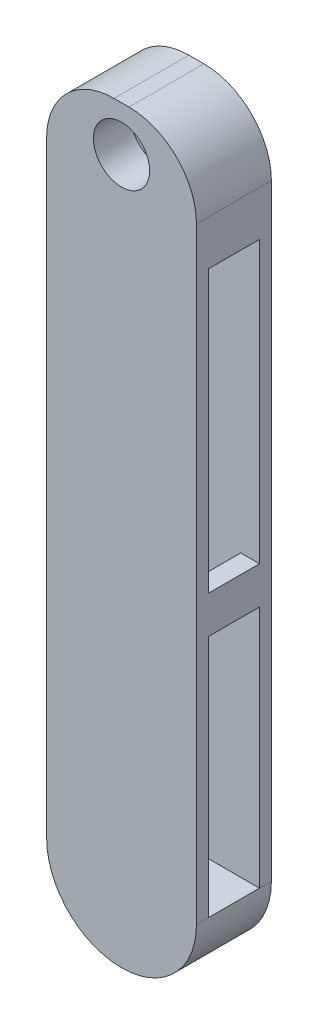
ISO-10303-21;
HEADER;
FILE_DESCRIPTION(('STEP AP214'),'2;1');
FILE_NAME('part.step','',(''),(''),'','','');
FILE_SCHEMA(('AUTOMOTIVE_DESIGN { 1 0 10303 214 1 1 1 1 }'));
ENDSEC;
DATA;
#1=APPLICATION_CONTEXT('core data for automotive mechanical design processes');
#2=APPLICATION_PROTOCOL_DEFINITION('international standard','automotive_design',2000,#1);
#3=PRODUCT_CONTEXT('',#1,'mechanical');
#4=PRODUCT('Part','Part','',(#3));
#5=PRODUCT_RELATED_PRODUCT_CATEGORY('part','',(#4));
#6=PRODUCT_DEFINITION_FORMATION('','',#4);
#7=PRODUCT_DEFINITION_CONTEXT('part definition',#1,'design');
#8=PRODUCT_DEFINITION('design','',#6,#7);
#9=PRODUCT_DEFINITION_SHAPE('','',#8);
#10=(LENGTH_UNIT() NAMED_UNIT(*) SI_UNIT(.MILLI.,.METRE.));
#11=(NAMED_UNIT(*) PLANE_ANGLE_UNIT() SI_UNIT($,.RADIAN.));
#12=(NAMED_UNIT(*) SI_UNIT($,.STERADIAN.) SOLID_ANGLE_UNIT());
#13=UNCERTAINTY_MEASURE_WITH_UNIT(LENGTH_MEASURE(1.E-05),#10,'distance_accuracy_value','');
#14=(GEOMETRIC_REPRESENTATION_CONTEXT(3) GLOBAL_UNCERTAINTY_ASSIGNED_CONTEXT((#13)) GLOBAL_UNIT_ASSIGNED_CONTEXT((#10,
#11,#12)) REPRESENTATION_CONTEXT('',''));
#15=CARTESIAN_POINT('',(0.,0.,0.));
#16=DIRECTION('',(0.,0.,1.));
#17=DIRECTION('',(1.,0.,0.));
#18=AXIS2_PLACEMENT_3D('',#15,#16,#17);
#19=CARTESIAN_POINT('',(20.,-80.,3.175));
#20=DIRECTION('',(0.,0.,-1.));
#21=DIRECTION('',(-1.,0.,0.));
#22=AXIS2_PLACEMENT_3D('',#19,#20,#21);
#23=PLANE('',#22);
#24=DIRECTION('',(0.,1.,0.));
#25=VECTOR('',#24,1.);
#26=CARTESIAN_POINT('',(15.,-80.,3.175));
#27=LINE('',#26,#25);
#28=CARTESIAN_POINT('',(15.,-15.,3.175));
#29=VERTEX_POINT('',#28);
#30=CARTESIAN_POINT('',(15.,-5.00000000000001,3.175));
#31=VERTEX_POINT('',#30);
#32=EDGE_CURVE('E209',#29,#31,#27,.T.);
#33=ORIENTED_EDGE('',*,*,#32,.T.);
#34=DIRECTION('',(1.,0.,0.));
#35=VECTOR('',#34,1.);
#36=CARTESIAN_POINT('',(20.,-5.,3.175));
#37=LINE('',#36,#35);
#38=CARTESIAN_POINT('',(20.,-5.,3.175));
#39=VERTEX_POINT('',#38);
#40=EDGE_CURVE('E173',#31,#39,#37,.T.);
#41=ORIENTED_EDGE('',*,*,#40,.T.);
#42=DIRECTION('',(0.,-1.,0.));
#43=VECTOR('',#42,1.);
#44=CARTESIAN_POINT('',(20.,-80.,3.175));
#45=LINE('',#44,#43);
#46=CARTESIAN_POINT('',(20.,70.,3.175));
#47=VERTEX_POINT('',#46);
#48=EDGE_CURVE('E253',#47,#39,#45,.T.);
#49=ORIENTED_EDGE('',*,*,#48,.F.);
#50=DIRECTION('',(-1.,0.,0.));
#51=VECTOR('',#50,1.);
#52=CARTESIAN_POINT('',(20.,70.,3.175));
#53=LINE('',#52,#51);
#54=CARTESIAN_POINT('',(-20.,70.,3.175));
#55=VERTEX_POINT('',#54);
#56=EDGE_CURVE('E286',#47,#55,#53,.T.);
#57=ORIENTED_EDGE('',*,*,#56,.T.);
#58=DIRECTION('',(0.,-1.,0.));
#59=VECTOR('',#58,1.);
#60=CARTESIAN_POINT('',(-20.,-80.,3.175));
#61=LINE('',#60,#59);
#62=CARTESIAN_POINT('',(-20.,-5.,3.175));
#63=VERTEX_POINT('',#62);
#64=EDGE_CURVE('E271',#55,#63,#61,.T.);
#65=ORIENTED_EDGE('',*,*,#64,.T.);
#66=DIRECTION('',(-1.,0.,0.));
#67=VECTOR('',#66,1.);
#68=CARTESIAN_POINT('',(20.,-5.,3.175));
#69=LINE('',#68,#67);
#70=CARTESIAN_POINT('',(-15.,-5.,3.175));
#71=VERTEX_POINT('',#70);
#72=EDGE_CURVE('E240',#71,#63,#69,.T.);
#73=ORIENTED_EDGE('',*,*,#72,.F.);
#74=DIRECTION('',(0.,1.,0.));
#75=VECTOR('',#74,1.);
#76=CARTESIAN_POINT('',(-15.,-80.,3.175));
#77=LINE('',#76,#75);
#78=CARTESIAN_POINT('',(-15.,-15.,3.175));
#79=VERTEX_POINT('',#78);
#80=EDGE_CURVE('E248',#79,#71,#77,.T.);
#81=ORIENTED_EDGE('',*,*,#80,.F.);
#82=DIRECTION('',(1.,0.,0.));
#83=VECTOR('',#82,1.);
#84=CARTESIAN_POINT('',(20.,-15.,3.175));
#85=LINE('',#84,#83);
#86=CARTESIAN_POINT('',(-20.,-15.,3.175));
#87=VERTEX_POINT('',#86);
#88=EDGE_CURVE('E244',#87,#79,#85,.T.);
#89=ORIENTED_EDGE('',*,*,#88,.F.);
#90=CARTESIAN_POINT('',(-20.,-80.,3.175));
#91=VERTEX_POINT('',#90);
#92=EDGE_CURVE('E252',#87,#91,#61,.T.);
#93=ORIENTED_EDGE('',*,*,#92,.T.);
#94=DIRECTION('',(-1.,0.,0.));
#95=VECTOR('',#94,1.);
#96=CARTESIAN_POINT('',(20.,-80.,3.175));
#97=LINE('',#96,#95);
#98=CARTESIAN_POINT('',(20.,-80.,3.175));
#99=VERTEX_POINT('',#98);
#100=EDGE_CURVE('E270',#99,#91,#97,.T.);
#101=ORIENTED_EDGE('',*,*,#100,.F.);
#102=CARTESIAN_POINT('',(20.,-15.,3.175));
#103=VERTEX_POINT('',#102);
#104=EDGE_CURVE('E258',#103,#99,#45,.T.);
#105=ORIENTED_EDGE('',*,*,#104,.F.);
#106=DIRECTION('',(-1.,0.,0.));
#107=VECTOR('',#106,1.);
#108=CARTESIAN_POINT('',(20.,-15.,3.175));
#109=LINE('',#108,#107);
#110=EDGE_CURVE('E177',#103,#29,#109,.T.);
#111=ORIENTED_EDGE('',*,*,#110,.T.);
#112=EDGE_LOOP('',(#33,#41,#49,#57,#65,#73,#81,#89,#93,#101,#105,#111));
#113=FACE_BOUND('',#112,.T.);
#114=ADVANCED_FACE('F39',(#113),#23,.F.);
#115=CARTESIAN_POINT('',(20.,-80.,16.825));
#116=DIRECTION('',(0.,0.,1.));
#117=DIRECTION('',(1.,0.,0.));
#118=AXIS2_PLACEMENT_3D('',#115,#116,#117);
#119=PLANE('',#118);
#120=DIRECTION('',(0.,1.,0.));
#121=VECTOR('',#120,1.);
#122=CARTESIAN_POINT('',(20.,-80.,16.825));
#123=LINE('',#122,#121);
#124=CARTESIAN_POINT('',(20.,-5.,16.825));
#125=VERTEX_POINT('',#124);
#126=CARTESIAN_POINT('',(20.,70.,16.825));
#127=VERTEX_POINT('',#126);
#128=EDGE_CURVE('E190',#125,#127,#123,.T.);
#129=ORIENTED_EDGE('',*,*,#128,.F.);
#130=DIRECTION('',(-1.,0.,0.));
#131=VECTOR('',#130,1.);
#132=CARTESIAN_POINT('',(20.,-5.,16.825));
#133=LINE('',#132,#131);
#134=CARTESIAN_POINT('',(15.,-5.00000000000001,16.825));
#135=VERTEX_POINT('',#134);
#136=EDGE_CURVE('E63',#125,#135,#133,.T.);
#137=ORIENTED_EDGE('',*,*,#136,.T.);
#138=DIRECTION('',(0.,-1.,0.));
#139=VECTOR('',#138,1.);
#140=CARTESIAN_POINT('',(15.,-5.00000000000001,16.825));
#141=LINE('',#140,#139);
#142=CARTESIAN_POINT('',(15.,-15.,16.825));
#143=VERTEX_POINT('',#142);
#144=EDGE_CURVE('E181',#135,#143,#141,.T.);
#145=ORIENTED_EDGE('',*,*,#144,.T.);
#146=DIRECTION('',(1.,0.,0.));
#147=VECTOR('',#146,1.);
#148=CARTESIAN_POINT('',(20.,-15.,16.825));
#149=LINE('',#148,#147);
#150=CARTESIAN_POINT('',(20.,-15.,16.825));
#151=VERTEX_POINT('',#150);
#152=EDGE_CURVE('E192',#143,#151,#149,.T.);
#153=ORIENTED_EDGE('',*,*,#152,.T.);
#154=CARTESIAN_POINT('',(20.,-80.,16.825));
#155=VERTEX_POINT('',#154);
#156=EDGE_CURVE('E262',#155,#151,#123,.T.);
#157=ORIENTED_EDGE('',*,*,#156,.F.);
#158=DIRECTION('',(-1.,0.,0.));
#159=VECTOR('',#158,1.);
#160=CARTESIAN_POINT('',(20.,-80.,16.825));
#161=LINE('',#160,#159);
#162=CARTESIAN_POINT('',(-20.,-80.,16.825));
#163=VERTEX_POINT('',#162);
#164=EDGE_CURVE('E294',#155,#163,#161,.T.);
#165=ORIENTED_EDGE('',*,*,#164,.T.);
#166=DIRECTION('',(0.,1.,0.));
#167=VECTOR('',#166,1.);
#168=CARTESIAN_POINT('',(-20.,-80.,16.825));
#169=LINE('',#168,#167);
#170=CARTESIAN_POINT('',(-20.,-15.,16.825));
#171=VERTEX_POINT('',#170);
#172=EDGE_CURVE('E279',#163,#171,#169,.T.);
#173=ORIENTED_EDGE('',*,*,#172,.T.);
#174=DIRECTION('',(-1.,0.,0.));
#175=VECTOR('',#174,1.);
#176=CARTESIAN_POINT('',(-20.,-15.,16.825));
#177=LINE('',#176,#175);
#178=CARTESIAN_POINT('',(-15.,-15.,16.825));
#179=VERTEX_POINT('',#178);
#180=EDGE_CURVE('E216',#179,#171,#177,.T.);
#181=ORIENTED_EDGE('',*,*,#180,.F.);
#182=DIRECTION('',(0.,-1.,0.));
#183=VECTOR('',#182,1.);
#184=CARTESIAN_POINT('',(-15.,-5.00000000000001,16.825));
#185=LINE('',#184,#183);
#186=CARTESIAN_POINT('',(-15.,-5.00000000000001,16.825));
#187=VERTEX_POINT('',#186);
#188=EDGE_CURVE('E212',#187,#179,#185,.T.);
#189=ORIENTED_EDGE('',*,*,#188,.F.);
#190=DIRECTION('',(1.,0.,0.));
#191=VECTOR('',#190,1.);
#192=CARTESIAN_POINT('',(-20.,-5.,16.825));
#193=LINE('',#192,#191);
#194=CARTESIAN_POINT('',(-20.,-4.99999999999999,16.825));
#195=VERTEX_POINT('',#194);
#196=EDGE_CURVE('E220',#195,#187,#193,.T.);
#197=ORIENTED_EDGE('',*,*,#196,.F.);
#198=CARTESIAN_POINT('',(-20.,70.,16.825));
#199=VERTEX_POINT('',#198);
#200=EDGE_CURVE('E278',#195,#199,#169,.T.);
#201=ORIENTED_EDGE('',*,*,#200,.T.);
#202=DIRECTION('',(-1.,0.,0.));
#203=VECTOR('',#202,1.);
#204=CARTESIAN_POINT('',(20.,70.,16.825));
#205=LINE('',#204,#203);
#206=EDGE_CURVE('E290',#127,#199,#205,.T.);
#207=ORIENTED_EDGE('',*,*,#206,.F.);
#208=EDGE_LOOP('',(#129,#137,#145,#153,#157,#165,#173,#181,#189,#197,#201,#207));
#209=FACE_BOUND('',#208,.T.);
#210=ADVANCED_FACE('F188',(#209),#119,.F.);
#211=CARTESIAN_POINT('',(20.,-100.,20.));
#212=DIRECTION('',(-1.,0.,0.));
#213=DIRECTION('',(0.,0.,1.));
#214=AXIS2_PLACEMENT_3D('',#211,#212,#213);
#215=PLANE('',#214);
#216=DIRECTION('',(0.,0.,1.));
#217=VECTOR('',#216,1.);
#218=CARTESIAN_POINT('',(20.,-15.,1.825));
#219=LINE('',#218,#217);
#220=EDGE_CURVE('E199',#103,#151,#219,.T.);
#221=ORIENTED_EDGE('',*,*,#220,.F.);
#222=ORIENTED_EDGE('',*,*,#104,.T.);
#223=DIRECTION('',(0.,0.,-1.));
#224=VECTOR('',#223,1.);
#225=CARTESIAN_POINT('',(20.,-80.,20.));
#226=LINE('',#225,#224);
#227=CARTESIAN_POINT('',(20.,-80.,0.));
#228=VERTEX_POINT('',#227);
#229=EDGE_CURVE('E330',#99,#228,#226,.T.);
#230=ORIENTED_EDGE('',*,*,#229,.T.);
#231=DIRECTION('',(0.,1.,0.));
#232=VECTOR('',#231,1.);
#233=CARTESIAN_POINT('',(20.,-100.,0.));
#234=LINE('',#233,#232);
#235=CARTESIAN_POINT('',(20.,82.,0.));
#236=VERTEX_POINT('',#235);
#237=EDGE_CURVE('E312',#228,#236,#234,.T.);
#238=ORIENTED_EDGE('',*,*,#237,.T.);
#239=DIRECTION('',(0.,0.,-1.));
#240=VECTOR('',#239,1.);
#241=CARTESIAN_POINT('',(20.,82.,20.));
#242=LINE('',#241,#240);
#243=CARTESIAN_POINT('',(20.,82.,20.));
#244=VERTEX_POINT('',#243);
#245=EDGE_CURVE('E378',#236,#244,#242,.F.);
#246=ORIENTED_EDGE('',*,*,#245,.T.);
#247=DIRECTION('',(0.,1.,0.));
#248=VECTOR('',#247,1.);
#249=CARTESIAN_POINT('',(20.,-100.,20.));
#250=LINE('',#249,#248);
#251=CARTESIAN_POINT('',(20.,-80.,20.));
#252=VERTEX_POINT('',#251);
#253=EDGE_CURVE('E317',#252,#244,#250,.T.);
#254=ORIENTED_EDGE('',*,*,#253,.F.);
#255=EDGE_CURVE('E340',#252,#155,#226,.T.);
#256=ORIENTED_EDGE('',*,*,#255,.T.);
#257=ORIENTED_EDGE('',*,*,#156,.T.);
#258=EDGE_LOOP('',(#221,#222,#230,#238,#246,#254,#256,#257));
#259=FACE_BOUND('',#258,.T.);
#260=ORIENTED_EDGE('',*,*,#48,.T.);
#261=DIRECTION('',(0.,0.,1.));
#262=VECTOR('',#261,1.);
#263=CARTESIAN_POINT('',(20.,-5.,1.825));
#264=LINE('',#263,#262);
#265=EDGE_CURVE('E178',#39,#125,#264,.T.);
#266=ORIENTED_EDGE('',*,*,#265,.T.);
#267=ORIENTED_EDGE('',*,*,#128,.T.);
#268=DIRECTION('',(0.,0.,-1.));
#269=VECTOR('',#268,1.);
#270=CARTESIAN_POINT('',(20.,70.,3.175));
#271=LINE('',#270,#269);
#272=EDGE_CURVE('E266',#127,#47,#271,.T.);
#273=ORIENTED_EDGE('',*,*,#272,.T.);
#274=EDGE_LOOP('',(#260,#266,#267,#273));
#275=FACE_BOUND('',#274,.T.);
#276=ADVANCED_FACE('F403',(#259,#275),#215,.F.);
#277=CARTESIAN_POINT('',(-20.,100.,20.));
#278=DIRECTION('',(0.,-1.,0.));
#279=DIRECTION('',(0.,0.,-1.));
#280=AXIS2_PLACEMENT_3D('',#277,#278,#279);
#281=PLANE('',#280);
#282=DIRECTION('',(-1.,0.,0.));
#283=VECTOR('',#282,1.);
#284=CARTESIAN_POINT('',(-20.,100.,20.));
#285=LINE('',#284,#283);
#286=CARTESIAN_POINT('',(2.00000000000001,100.,20.));
#287=VERTEX_POINT('',#286);
#288=CARTESIAN_POINT('',(-2.,100.,20.));
#289=VERTEX_POINT('',#288);
#290=EDGE_CURVE('E321',#287,#289,#285,.T.);
#291=ORIENTED_EDGE('',*,*,#290,.F.);
#292=DIRECTION('',(0.,0.,-1.));
#293=VECTOR('',#292,1.);
#294=CARTESIAN_POINT('',(2.00000000000001,100.,20.));
#295=LINE('',#294,#293);
#296=CARTESIAN_POINT('',(2.00000000000001,100.,0.));
#297=VERTEX_POINT('',#296);
#298=EDGE_CURVE('E368',#287,#297,#295,.T.);
#299=ORIENTED_EDGE('',*,*,#298,.T.);
#300=DIRECTION('',(-1.,0.,0.));
#301=VECTOR('',#300,1.);
#302=CARTESIAN_POINT('',(-20.,100.,0.));
#303=LINE('',#302,#301);
#304=CARTESIAN_POINT('',(-2.,100.,0.));
#305=VERTEX_POINT('',#304);
#306=EDGE_CURVE('E334',#297,#305,#303,.T.);
#307=ORIENTED_EDGE('',*,*,#306,.T.);
#308=DIRECTION('',(0.,0.,-1.));
#309=VECTOR('',#308,1.);
#310=CARTESIAN_POINT('',(-2.,100.,20.));
#311=LINE('',#310,#309);
#312=EDGE_CURVE('E362',#305,#289,#311,.F.);
#313=ORIENTED_EDGE('',*,*,#312,.T.);
#314=EDGE_LOOP('',(#291,#299,#307,#313));
#315=FACE_BOUND('',#314,.T.);
#316=ADVANCED_FACE('F394',(#315),#281,.F.);
#317=CARTESIAN_POINT('',(-20.,-100.,20.));
#318=DIRECTION('',(1.,0.,0.));
#319=DIRECTION('',(0.,0.,-1.));
#320=AXIS2_PLACEMENT_3D('',#317,#318,#319);
#321=PLANE('',#320);
#322=ORIENTED_EDGE('',*,*,#92,.F.);
#323=DIRECTION('',(0.,0.,1.));
#324=VECTOR('',#323,1.);
#325=CARTESIAN_POINT('',(-20.,-15.,1.825));
#326=LINE('',#325,#324);
#327=EDGE_CURVE('E232',#87,#171,#326,.T.);
#328=ORIENTED_EDGE('',*,*,#327,.T.);
#329=ORIENTED_EDGE('',*,*,#172,.F.);
#330=DIRECTION('',(0.,0.,-1.));
#331=VECTOR('',#330,1.);
#332=CARTESIAN_POINT('',(-20.,-80.,20.));
#333=LINE('',#332,#331);
#334=CARTESIAN_POINT('',(-20.,-80.,20.));
#335=VERTEX_POINT('',#334);
#336=EDGE_CURVE('E357',#163,#335,#333,.F.);
#337=ORIENTED_EDGE('',*,*,#336,.T.);
#338=DIRECTION('',(0.,-1.,0.));
#339=VECTOR('',#338,1.);
#340=CARTESIAN_POINT('',(-20.,-100.,20.));
#341=LINE('',#340,#339);
#342=CARTESIAN_POINT('',(-20.,82.,20.));
#343=VERTEX_POINT('',#342);
#344=EDGE_CURVE('E326',#343,#335,#341,.T.);
#345=ORIENTED_EDGE('',*,*,#344,.F.);
#346=DIRECTION('',(0.,0.,-1.));
#347=VECTOR('',#346,1.);
#348=CARTESIAN_POINT('',(-20.,82.,20.));
#349=LINE('',#348,#347);
#350=CARTESIAN_POINT('',(-20.,82.,0.));
#351=VERTEX_POINT('',#350);
#352=EDGE_CURVE('E11',#343,#351,#349,.T.);
#353=ORIENTED_EDGE('',*,*,#352,.T.);
#354=DIRECTION('',(0.,-1.,0.));
#355=VECTOR('',#354,1.);
#356=CARTESIAN_POINT('',(-20.,-100.,0.));
#357=LINE('',#356,#355);
#358=CARTESIAN_POINT('',(-20.,-80.,0.));
#359=VERTEX_POINT('',#358);
#360=EDGE_CURVE('E322',#351,#359,#357,.T.);
#361=ORIENTED_EDGE('',*,*,#360,.T.);
#362=EDGE_CURVE('E358',#359,#91,#333,.F.);
#363=ORIENTED_EDGE('',*,*,#362,.T.);
#364=EDGE_LOOP('',(#322,#328,#329,#337,#345,#353,#361,#363));
#365=FACE_BOUND('',#364,.T.);
#366=DIRECTION('',(0.,0.,1.));
#367=VECTOR('',#366,1.);
#368=CARTESIAN_POINT('',(-20.,-5.,1.825));
#369=LINE('',#368,#367);
#370=EDGE_CURVE('E228',#63,#195,#369,.T.);
#371=ORIENTED_EDGE('',*,*,#370,.F.);
#372=ORIENTED_EDGE('',*,*,#64,.F.);
#373=DIRECTION('',(0.,0.,-1.));
#374=VECTOR('',#373,1.);
#375=CARTESIAN_POINT('',(-20.,70.,3.175));
#376=LINE('',#375,#374);
#377=EDGE_CURVE('E282',#199,#55,#376,.T.);
#378=ORIENTED_EDGE('',*,*,#377,.F.);
#379=ORIENTED_EDGE('',*,*,#200,.F.);
#380=EDGE_LOOP('',(#371,#372,#378,#379));
#381=FACE_BOUND('',#380,.T.);
#382=ADVANCED_FACE('F424',(#365,#381),#321,.F.);
#383=CARTESIAN_POINT('',(0.,0.,20.));
#384=DIRECTION('',(0.,0.,-1.));
#385=DIRECTION('',(-1.,0.,0.));
#386=AXIS2_PLACEMENT_3D('',#383,#384,#385);
#387=PLANE('',#386);
#388=CARTESIAN_POINT('',(0.,88.,20.));
#389=DIRECTION('',(0.,0.,1.));
#390=DIRECTION('',(1.,0.,0.));
#391=AXIS2_PLACEMENT_3D('',#388,#389,#390);
#392=CIRCLE('',#391,7.5);
#393=CARTESIAN_POINT('',(7.5,88.,20.));
#394=VERTEX_POINT('',#393);
#395=EDGE_CURVE('E289',#394,#394,#392,.T.);
#396=ORIENTED_EDGE('',*,*,#395,.F.);
#397=EDGE_LOOP('',(#396));
#398=FACE_BOUND('',#397,.T.);
#399=ORIENTED_EDGE('',*,*,#253,.T.);
#400=CARTESIAN_POINT('',(2.00000000000001,82.,20.));
#401=DIRECTION('',(0.,0.,-1.));
#402=DIRECTION('',(-1.,0.,0.));
#403=AXIS2_PLACEMENT_3D('',#400,#401,#402);
#404=CIRCLE('',#403,18.);
#405=EDGE_CURVE('E48',#244,#287,#404,.F.);
#406=ORIENTED_EDGE('',*,*,#405,.T.);
#407=ORIENTED_EDGE('',*,*,#290,.T.);
#408=CARTESIAN_POINT('',(-2.,82.,20.));
#409=DIRECTION('',(0.,0.,-1.));
#410=DIRECTION('',(-1.,0.,0.));
#411=AXIS2_PLACEMENT_3D('',#408,#409,#410);
#412=CIRCLE('',#411,18.);
#413=EDGE_CURVE('E381',#289,#343,#412,.F.);
#414=ORIENTED_EDGE('',*,*,#413,.T.);
#415=ORIENTED_EDGE('',*,*,#344,.T.);
#416=CARTESIAN_POINT('',(0.,-80.,20.));
#417=DIRECTION('',(0.,0.,-1.));
#418=DIRECTION('',(-1.,0.,0.));
#419=AXIS2_PLACEMENT_3D('',#416,#417,#418);
#420=CIRCLE('',#419,20.);
#421=CARTESIAN_POINT('',(0.,-100.,20.));
#422=VERTEX_POINT('',#421);
#423=EDGE_CURVE('E351',#335,#422,#420,.F.);
#424=ORIENTED_EDGE('',*,*,#423,.T.);
#425=CARTESIAN_POINT('',(0.,-80.,20.));
#426=DIRECTION('',(0.,0.,-1.));
#427=DIRECTION('',(-1.,0.,0.));
#428=AXIS2_PLACEMENT_3D('',#425,#426,#427);
#429=CIRCLE('',#428,20.);
#430=EDGE_CURVE('E354',#422,#252,#429,.F.);
#431=ORIENTED_EDGE('',*,*,#430,.T.);
#432=EDGE_LOOP('',(#399,#406,#407,#414,#415,#424,#431));
#433=FACE_BOUND('',#432,.T.);
#434=ADVANCED_FACE('F387',(#398,#433),#387,.F.);
#435=CARTESIAN_POINT('',(0.,0.,0.));
#436=DIRECTION('',(0.,0.,-1.));
#437=DIRECTION('',(-1.,0.,0.));
#438=AXIS2_PLACEMENT_3D('',#435,#436,#437);
#439=PLANE('',#438);
#440=CARTESIAN_POINT('',(0.,-90.,0.));
#441=DIRECTION('',(0.,0.,-1.));
#442=DIRECTION('',(-1.,0.,0.));
#443=AXIS2_PLACEMENT_3D('',#440,#441,#442);
#444=CIRCLE('',#443,2.);
#445=CARTESIAN_POINT('',(-2.,-90.,0.));
#446=VERTEX_POINT('',#445);
#447=EDGE_CURVE('E313',#446,#446,#444,.T.);
#448=ORIENTED_EDGE('',*,*,#447,.F.);
#449=EDGE_LOOP('',(#448));
#450=FACE_BOUND('',#449,.T.);
#451=ORIENTED_EDGE('',*,*,#306,.F.);
#452=CARTESIAN_POINT('',(2.00000000000001,82.,0.));
#453=DIRECTION('',(0.,0.,-1.));
#454=DIRECTION('',(-1.,0.,0.));
#455=AXIS2_PLACEMENT_3D('',#452,#453,#454);
#456=CIRCLE('',#455,18.);
#457=EDGE_CURVE('E375',#297,#236,#456,.T.);
#458=ORIENTED_EDGE('',*,*,#457,.T.);
#459=ORIENTED_EDGE('',*,*,#237,.F.);
#460=CARTESIAN_POINT('',(0.,-80.,0.));
#461=DIRECTION('',(0.,0.,-1.));
#462=DIRECTION('',(-1.,0.,0.));
#463=AXIS2_PLACEMENT_3D('',#460,#461,#462);
#464=CIRCLE('',#463,20.);
#465=CARTESIAN_POINT('',(0.,-100.,0.));
#466=VERTEX_POINT('',#465);
#467=EDGE_CURVE('E348',#228,#466,#464,.T.);
#468=ORIENTED_EDGE('',*,*,#467,.T.);
#469=CARTESIAN_POINT('',(0.,-80.,0.));
#470=DIRECTION('',(0.,0.,-1.));
#471=DIRECTION('',(-1.,0.,0.));
#472=AXIS2_PLACEMENT_3D('',#469,#470,#471);
#473=CIRCLE('',#472,20.);
#474=EDGE_CURVE('E344',#466,#359,#473,.T.);
#475=ORIENTED_EDGE('',*,*,#474,.T.);
#476=ORIENTED_EDGE('',*,*,#360,.F.);
#477=CARTESIAN_POINT('',(-2.,82.,0.));
#478=DIRECTION('',(0.,0.,-1.));
#479=DIRECTION('',(-1.,0.,0.));
#480=AXIS2_PLACEMENT_3D('',#477,#478,#479);
#481=CIRCLE('',#480,18.);
#482=EDGE_CURVE('E372',#351,#305,#481,.T.);
#483=ORIENTED_EDGE('',*,*,#482,.T.);
#484=EDGE_LOOP('',(#451,#458,#459,#468,#475,#476,#483));
#485=FACE_BOUND('',#484,.T.);
#486=ADVANCED_FACE('F400',(#450,#485),#439,.T.);
#487=CARTESIAN_POINT('',(0.,-90.,10.));
#488=DIRECTION('',(0.,0.,-1.));
#489=DIRECTION('',(-1.,0.,0.));
#490=AXIS2_PLACEMENT_3D('',#487,#488,#489);
#491=CYLINDRICAL_SURFACE('',#490,2.);
#492=CARTESIAN_POINT('',(0.,-90.,10.));
#493=DIRECTION('',(0.,0.,-1.));
#494=DIRECTION('',(-1.,0.,0.));
#495=AXIS2_PLACEMENT_3D('',#492,#493,#494);
#496=CIRCLE('',#495,2.);
#497=CARTESIAN_POINT('',(-2.,-90.,10.));
#498=VERTEX_POINT('',#497);
#499=EDGE_CURVE('E308',#498,#498,#496,.T.);
#500=ORIENTED_EDGE('',*,*,#499,.F.);
#501=EDGE_LOOP('',(#500));
#502=FACE_BOUND('',#501,.T.);
#503=ORIENTED_EDGE('',*,*,#447,.T.);
#504=EDGE_LOOP('',(#503));
#505=FACE_BOUND('',#504,.T.);
#506=ADVANCED_FACE('F486',(#502,#505),#491,.F.);
#507=CARTESIAN_POINT('',(0.,-90.,10.));
#508=DIRECTION('',(0.,0.,-1.));
#509=DIRECTION('',(-1.,0.,0.));
#510=AXIS2_PLACEMENT_3D('',#507,#508,#509);
#511=PLANE('',#510);
#512=ORIENTED_EDGE('',*,*,#499,.T.);
#513=EDGE_LOOP('',(#512));
#514=FACE_BOUND('',#513,.T.);
#515=ADVANCED_FACE('F483',(#514),#511,.T.);
#516=CARTESIAN_POINT('',(0.,-80.,20.));
#517=DIRECTION('',(0.,0.,-1.));
#518=DIRECTION('',(-1.,0.,0.));
#519=AXIS2_PLACEMENT_3D('',#516,#517,#518);
#520=CYLINDRICAL_SURFACE('',#519,20.);
#521=DIRECTION('',(0.,0.,-1.));
#522=VECTOR('',#521,1.);
#523=CARTESIAN_POINT('',(0.,-100.,20.));
#524=LINE('',#523,#522);
#525=EDGE_CURVE('E304',#422,#466,#524,.T.);
#526=ORIENTED_EDGE('',*,*,#525,.F.);
#527=ORIENTED_EDGE('',*,*,#423,.F.);
#528=ORIENTED_EDGE('',*,*,#336,.F.);
#529=DIRECTION('',(0.,0.,1.));
#530=VECTOR('',#529,1.);
#531=CARTESIAN_POINT('',(-20.,-80.,3.175));
#532=LINE('',#531,#530);
#533=EDGE_CURVE('E274',#91,#163,#532,.T.);
#534=ORIENTED_EDGE('',*,*,#533,.F.);
#535=ORIENTED_EDGE('',*,*,#362,.F.);
#536=ORIENTED_EDGE('',*,*,#474,.F.);
#537=EDGE_LOOP('',(#526,#527,#528,#534,#535,#536));
#538=FACE_BOUND('',#537,.T.);
#539=ADVANCED_FACE('F418',(#538),#520,.T.);
#540=CARTESIAN_POINT('',(0.,-80.,20.));
#541=DIRECTION('',(0.,0.,-1.));
#542=DIRECTION('',(-1.,0.,0.));
#543=AXIS2_PLACEMENT_3D('',#540,#541,#542);
#544=CYLINDRICAL_SURFACE('',#543,20.);
#545=ORIENTED_EDGE('',*,*,#430,.F.);
#546=ORIENTED_EDGE('',*,*,#525,.T.);
#547=ORIENTED_EDGE('',*,*,#467,.F.);
#548=ORIENTED_EDGE('',*,*,#229,.F.);
#549=DIRECTION('',(0.,0.,1.));
#550=VECTOR('',#549,1.);
#551=CARTESIAN_POINT('',(20.,-80.,3.175));
#552=LINE('',#551,#550);
#553=EDGE_CURVE('E257',#99,#155,#552,.T.);
#554=ORIENTED_EDGE('',*,*,#553,.T.);
#555=ORIENTED_EDGE('',*,*,#255,.F.);
#556=EDGE_LOOP('',(#545,#546,#547,#548,#554,#555));
#557=FACE_BOUND('',#556,.T.);
#558=ADVANCED_FACE('F412',(#557),#544,.T.);
#559=CARTESIAN_POINT('',(0.,88.,10.));
#560=DIRECTION('',(0.,0.,1.));
#561=DIRECTION('',(1.,0.,0.));
#562=AXIS2_PLACEMENT_3D('',#559,#560,#561);
#563=CYLINDRICAL_SURFACE('',#562,7.5);
#564=CARTESIAN_POINT('',(0.,88.,10.));
#565=DIRECTION('',(0.,0.,1.));
#566=DIRECTION('',(1.,0.,0.));
#567=AXIS2_PLACEMENT_3D('',#564,#565,#566);
#568=CIRCLE('',#567,7.5);
#569=CARTESIAN_POINT('',(7.5,88.,10.));
#570=VERTEX_POINT('',#569);
#571=EDGE_CURVE('E300',#570,#570,#568,.T.);
#572=ORIENTED_EDGE('',*,*,#571,.F.);
#573=EDGE_LOOP('',(#572));
#574=FACE_BOUND('',#573,.T.);
#575=ORIENTED_EDGE('',*,*,#395,.T.);
#576=EDGE_LOOP('',(#575));
#577=FACE_BOUND('',#576,.T.);
#578=ADVANCED_FACE('F478',(#574,#577),#563,.F.);
#579=CARTESIAN_POINT('',(0.,88.,10.));
#580=DIRECTION('',(0.,0.,1.));
#581=DIRECTION('',(1.,0.,0.));
#582=AXIS2_PLACEMENT_3D('',#579,#580,#581);
#583=PLANE('',#582);
#584=ORIENTED_EDGE('',*,*,#571,.T.);
#585=EDGE_LOOP('',(#584));
#586=FACE_BOUND('',#585,.T.);
#587=ADVANCED_FACE('F475',(#586),#583,.T.);
#588=CARTESIAN_POINT('',(2.00000000000001,82.,20.));
#589=DIRECTION('',(0.,0.,-1.));
#590=DIRECTION('',(-1.,0.,0.));
#591=AXIS2_PLACEMENT_3D('',#588,#589,#590);
#592=CYLINDRICAL_SURFACE('',#591,18.);
#593=ORIENTED_EDGE('',*,*,#405,.F.);
#594=ORIENTED_EDGE('',*,*,#245,.F.);
#595=ORIENTED_EDGE('',*,*,#457,.F.);
#596=ORIENTED_EDGE('',*,*,#298,.F.);
#597=EDGE_LOOP('',(#593,#594,#595,#596));
#598=FACE_BOUND('',#597,.T.);
#599=ADVANCED_FACE('F397',(#598),#592,.T.);
#600=CARTESIAN_POINT('',(-2.,82.,20.));
#601=DIRECTION('',(0.,0.,-1.));
#602=DIRECTION('',(-1.,0.,0.));
#603=AXIS2_PLACEMENT_3D('',#600,#601,#602);
#604=CYLINDRICAL_SURFACE('',#603,18.);
#605=ORIENTED_EDGE('',*,*,#413,.F.);
#606=ORIENTED_EDGE('',*,*,#312,.F.);
#607=ORIENTED_EDGE('',*,*,#482,.F.);
#608=ORIENTED_EDGE('',*,*,#352,.F.);
#609=EDGE_LOOP('',(#605,#606,#607,#608));
#610=FACE_BOUND('',#609,.T.);
#611=ADVANCED_FACE('F41',(#610),#604,.T.);
#612=CARTESIAN_POINT('',(20.,70.,3.175));
#613=DIRECTION('',(0.,1.,0.));
#614=DIRECTION('',(0.,0.,1.));
#615=AXIS2_PLACEMENT_3D('',#612,#613,#614);
#616=PLANE('',#615);
#617=ORIENTED_EDGE('',*,*,#377,.T.);
#618=ORIENTED_EDGE('',*,*,#56,.F.);
#619=ORIENTED_EDGE('',*,*,#272,.F.);
#620=ORIENTED_EDGE('',*,*,#206,.T.);
#621=EDGE_LOOP('',(#617,#618,#619,#620));
#622=FACE_BOUND('',#621,.T.);
#623=ADVANCED_FACE('F446',(#622),#616,.F.);
#624=CARTESIAN_POINT('',(20.,-80.,3.175));
#625=DIRECTION('',(0.,-1.,0.));
#626=DIRECTION('',(0.,0.,-1.));
#627=AXIS2_PLACEMENT_3D('',#624,#625,#626);
#628=PLANE('',#627);
#629=ORIENTED_EDGE('',*,*,#533,.T.);
#630=ORIENTED_EDGE('',*,*,#164,.F.);
#631=ORIENTED_EDGE('',*,*,#553,.F.);
#632=ORIENTED_EDGE('',*,*,#100,.T.);
#633=EDGE_LOOP('',(#629,#630,#631,#632));
#634=FACE_BOUND('',#633,.T.);
#635=ADVANCED_FACE('F439',(#634),#628,.F.);
#636=CARTESIAN_POINT('',(-15.,-5.00000000000001,1.825));
#637=DIRECTION('',(-1.,0.,0.));
#638=DIRECTION('',(0.,0.,1.));
#639=AXIS2_PLACEMENT_3D('',#636,#637,#638);
#640=PLANE('',#639);
#641=DIRECTION('',(0.,0.,1.));
#642=VECTOR('',#641,1.);
#643=CARTESIAN_POINT('',(-15.,-15.,1.825));
#644=LINE('',#643,#642);
#645=EDGE_CURVE('E236',#79,#179,#644,.T.);
#646=ORIENTED_EDGE('',*,*,#645,.F.);
#647=ORIENTED_EDGE('',*,*,#80,.T.);
#648=DIRECTION('',(0.,0.,1.));
#649=VECTOR('',#648,1.);
#650=CARTESIAN_POINT('',(-15.,-5.00000000000001,1.825));
#651=LINE('',#650,#649);
#652=EDGE_CURVE('E224',#71,#187,#651,.T.);
#653=ORIENTED_EDGE('',*,*,#652,.T.);
#654=ORIENTED_EDGE('',*,*,#188,.T.);
#655=EDGE_LOOP('',(#646,#647,#653,#654));
#656=FACE_BOUND('',#655,.T.);
#657=ADVANCED_FACE('F456',(#656),#640,.F.);
#658=CARTESIAN_POINT('',(-20.,-15.,1.825));
#659=DIRECTION('',(0.,1.,0.));
#660=DIRECTION('',(0.,0.,1.));
#661=AXIS2_PLACEMENT_3D('',#658,#659,#660);
#662=PLANE('',#661);
#663=ORIENTED_EDGE('',*,*,#327,.F.);
#664=ORIENTED_EDGE('',*,*,#88,.T.);
#665=ORIENTED_EDGE('',*,*,#645,.T.);
#666=ORIENTED_EDGE('',*,*,#180,.T.);
#667=EDGE_LOOP('',(#663,#664,#665,#666));
#668=FACE_BOUND('',#667,.T.);
#669=ADVANCED_FACE('F458',(#668),#662,.F.);
#670=CARTESIAN_POINT('',(-20.,-5.,1.825));
#671=DIRECTION('',(0.,-1.,0.));
#672=DIRECTION('',(1.,0.,0.));
#673=AXIS2_PLACEMENT_3D('',#670,#671,#672);
#674=PLANE('',#673);
#675=ORIENTED_EDGE('',*,*,#652,.F.);
#676=ORIENTED_EDGE('',*,*,#72,.T.);
#677=ORIENTED_EDGE('',*,*,#370,.T.);
#678=ORIENTED_EDGE('',*,*,#196,.T.);
#679=EDGE_LOOP('',(#675,#676,#677,#678));
#680=FACE_BOUND('',#679,.T.);
#681=ADVANCED_FACE('F452',(#680),#674,.F.);
#682=CARTESIAN_POINT('',(15.,-5.00000000000001,1.825));
#683=DIRECTION('',(-1.,0.,0.));
#684=DIRECTION('',(0.,0.,1.));
#685=AXIS2_PLACEMENT_3D('',#682,#683,#684);
#686=PLANE('',#685);
#687=ORIENTED_EDGE('',*,*,#32,.F.);
#688=DIRECTION('',(0.,0.,1.));
#689=VECTOR('',#688,1.);
#690=CARTESIAN_POINT('',(15.,-15.,1.825));
#691=LINE('',#690,#689);
#692=EDGE_CURVE('E55',#29,#143,#691,.T.);
#693=ORIENTED_EDGE('',*,*,#692,.T.);
#694=ORIENTED_EDGE('',*,*,#144,.F.);
#695=DIRECTION('',(0.,0.,1.));
#696=VECTOR('',#695,1.);
#697=CARTESIAN_POINT('',(15.,-5.00000000000001,1.825));
#698=LINE('',#697,#696);
#699=EDGE_CURVE('E169',#31,#135,#698,.T.);
#700=ORIENTED_EDGE('',*,*,#699,.F.);
#701=EDGE_LOOP('',(#687,#693,#694,#700));
#702=FACE_BOUND('',#701,.T.);
#703=ADVANCED_FACE('F182',(#702),#686,.T.);
#704=CARTESIAN_POINT('',(20.,-5.,1.825));
#705=DIRECTION('',(0.,1.,0.));
#706=DIRECTION('',(-1.,0.,0.));
#707=AXIS2_PLACEMENT_3D('',#704,#705,#706);
#708=PLANE('',#707);
#709=ORIENTED_EDGE('',*,*,#40,.F.);
#710=ORIENTED_EDGE('',*,*,#699,.T.);
#711=ORIENTED_EDGE('',*,*,#136,.F.);
#712=ORIENTED_EDGE('',*,*,#265,.F.);
#713=EDGE_LOOP('',(#709,#710,#711,#712));
#714=FACE_BOUND('',#713,.T.);
#715=ADVANCED_FACE('F171',(#714),#708,.T.);
#716=CARTESIAN_POINT('',(20.,-15.,1.825));
#717=DIRECTION('',(0.,-1.,0.));
#718=DIRECTION('',(0.,0.,-1.));
#719=AXIS2_PLACEMENT_3D('',#716,#717,#718);
#720=PLANE('',#719);
#721=ORIENTED_EDGE('',*,*,#110,.F.);
#722=ORIENTED_EDGE('',*,*,#220,.T.);
#723=ORIENTED_EDGE('',*,*,#152,.F.);
#724=ORIENTED_EDGE('',*,*,#692,.F.);
#725=EDGE_LOOP('',(#721,#722,#723,#724));
#726=FACE_BOUND('',#725,.T.);
#727=ADVANCED_FACE('F442',(#726),#720,.T.);
#728=CLOSED_SHELL('',(#114,#210,#276,#316,#382,#434,#486,#506,#515,#539,#558,#578,#587,#599,
#611,#623,#635,#657,#669,#681,#703,#715,#727));
#729=MANIFOLD_SOLID_BREP('B2',#728);
#730=ADVANCED_BREP_SHAPE_REPRESENTATION('',(#18,#729),#14);
#731=SHAPE_DEFINITION_REPRESENTATION(#9,#730);
ENDSEC;
END-ISO-10303-21;
